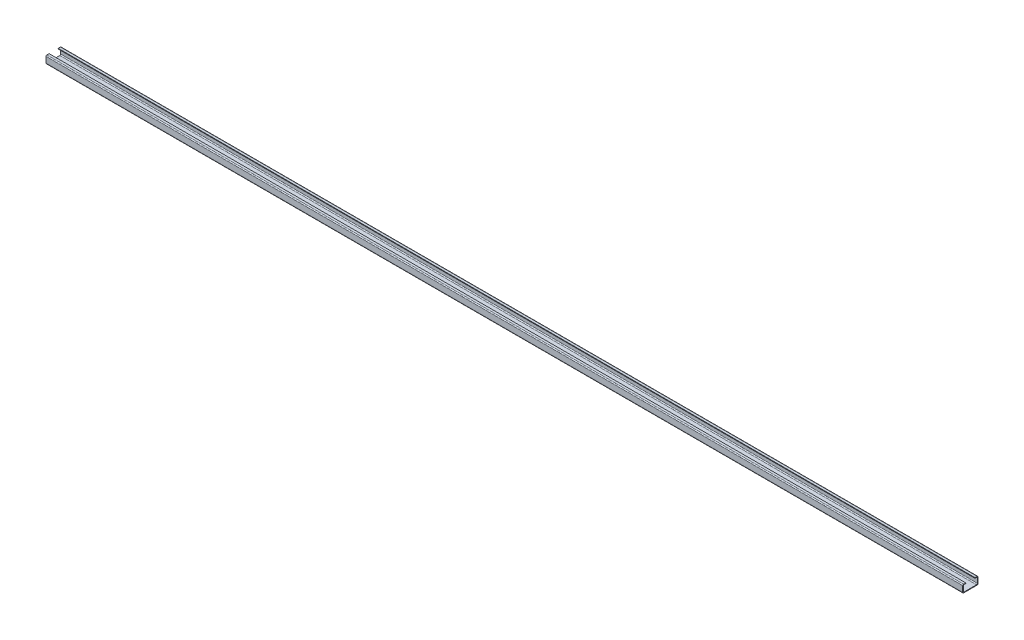
ISO-10303-21;
HEADER;
FILE_DESCRIPTION(('STEP AP214'),'2;1');
FILE_NAME('part.step','',(''),(''),'','','');
FILE_SCHEMA(('AUTOMOTIVE_DESIGN { 1 0 10303 214 1 1 1 1 }'));
ENDSEC;
DATA;
#1=APPLICATION_CONTEXT('core data for automotive mechanical design processes');
#2=APPLICATION_PROTOCOL_DEFINITION('international standard','automotive_design',2000,#1);
#3=PRODUCT_CONTEXT('',#1,'mechanical');
#4=PRODUCT('Part','Part','',(#3));
#5=PRODUCT_RELATED_PRODUCT_CATEGORY('part','',(#4));
#6=PRODUCT_DEFINITION_FORMATION('','',#4);
#7=PRODUCT_DEFINITION_CONTEXT('part definition',#1,'design');
#8=PRODUCT_DEFINITION('design','',#6,#7);
#9=PRODUCT_DEFINITION_SHAPE('','',#8);
#10=(LENGTH_UNIT() NAMED_UNIT(*) SI_UNIT(.MILLI.,.METRE.));
#11=(NAMED_UNIT(*) PLANE_ANGLE_UNIT() SI_UNIT($,.RADIAN.));
#12=(NAMED_UNIT(*) SI_UNIT($,.STERADIAN.) SOLID_ANGLE_UNIT());
#13=UNCERTAINTY_MEASURE_WITH_UNIT(LENGTH_MEASURE(1.E-05),#10,'distance_accuracy_value','');
#14=(GEOMETRIC_REPRESENTATION_CONTEXT(3) GLOBAL_UNCERTAINTY_ASSIGNED_CONTEXT((#13)) GLOBAL_UNIT_ASSIGNED_CONTEXT((#10,
#11,#12)) REPRESENTATION_CONTEXT('',''));
#15=CARTESIAN_POINT('',(0.,0.,0.));
#16=DIRECTION('',(0.,0.,1.));
#17=DIRECTION('',(1.,0.,0.));
#18=AXIS2_PLACEMENT_3D('',#15,#16,#17);
#19=CARTESIAN_POINT('',(6000.,25.,-50.));
#20=DIRECTION('',(0.,0.,1.));
#21=DIRECTION('',(0.,-1.,0.));
#22=AXIS2_PLACEMENT_3D('',#19,#20,#21);
#23=PLANE('',#22);
#24=DIRECTION('',(0.,1.,0.));
#25=VECTOR('',#24,1.);
#26=CARTESIAN_POINT('',(0.,25.,-50.));
#27=LINE('',#26,#25);
#28=CARTESIAN_POINT('',(0.,-19.,-50.));
#29=VERTEX_POINT('',#28);
#30=CARTESIAN_POINT('',(0.,19.,-50.));
#31=VERTEX_POINT('',#30);
#32=EDGE_CURVE('E227',#29,#31,#27,.T.);
#33=ORIENTED_EDGE('',*,*,#32,.T.);
#34=DIRECTION('',(-1.,0.,0.));
#35=VECTOR('',#34,1.);
#36=CARTESIAN_POINT('',(6000.,19.,-50.));
#37=LINE('',#36,#35);
#38=CARTESIAN_POINT('',(6000.,19.,-50.));
#39=VERTEX_POINT('',#38);
#40=EDGE_CURVE('E303',#31,#39,#37,.F.);
#41=ORIENTED_EDGE('',*,*,#40,.T.);
#42=DIRECTION('',(0.,1.,0.));
#43=VECTOR('',#42,1.);
#44=CARTESIAN_POINT('',(6000.,25.,-50.));
#45=LINE('',#44,#43);
#46=CARTESIAN_POINT('',(6000.,-19.,-50.));
#47=VERTEX_POINT('',#46);
#48=EDGE_CURVE('E187',#47,#39,#45,.T.);
#49=ORIENTED_EDGE('',*,*,#48,.F.);
#50=DIRECTION('',(-1.,0.,0.));
#51=VECTOR('',#50,1.);
#52=CARTESIAN_POINT('',(6000.,-19.,-50.));
#53=LINE('',#52,#51);
#54=EDGE_CURVE('E300',#47,#29,#53,.T.);
#55=ORIENTED_EDGE('',*,*,#54,.T.);
#56=EDGE_LOOP('',(#33,#41,#49,#55));
#57=FACE_BOUND('',#56,.T.);
#58=ADVANCED_FACE('F37',(#57),#23,.F.);
#59=CARTESIAN_POINT('',(6000.,25.,-30.));
#60=DIRECTION('',(0.,-1.,0.));
#61=DIRECTION('',(0.,0.,-1.));
#62=AXIS2_PLACEMENT_3D('',#59,#60,#61);
#63=PLANE('',#62);
#64=DIRECTION('',(0.,0.,1.));
#65=VECTOR('',#64,1.);
#66=CARTESIAN_POINT('',(6000.,25.,-30.));
#67=LINE('',#66,#65);
#68=CARTESIAN_POINT('',(6000.,25.,-44.));
#69=VERTEX_POINT('',#68);
#70=CARTESIAN_POINT('',(6000.,25.,-30.));
#71=VERTEX_POINT('',#70);
#72=EDGE_CURVE('E173',#69,#71,#67,.T.);
#73=ORIENTED_EDGE('',*,*,#72,.F.);
#74=DIRECTION('',(-1.,0.,0.));
#75=VECTOR('',#74,1.);
#76=CARTESIAN_POINT('',(6000.,25.,-44.));
#77=LINE('',#76,#75);
#78=CARTESIAN_POINT('',(0.,25.,-44.));
#79=VERTEX_POINT('',#78);
#80=EDGE_CURVE('E298',#69,#79,#77,.T.);
#81=ORIENTED_EDGE('',*,*,#80,.T.);
#82=DIRECTION('',(0.,0.,1.));
#83=VECTOR('',#82,1.);
#84=CARTESIAN_POINT('',(0.,25.,-30.));
#85=LINE('',#84,#83);
#86=CARTESIAN_POINT('',(0.,25.,-30.));
#87=VERTEX_POINT('',#86);
#88=EDGE_CURVE('E193',#79,#87,#85,.T.);
#89=ORIENTED_EDGE('',*,*,#88,.T.);
#90=DIRECTION('',(-1.,0.,0.));
#91=VECTOR('',#90,1.);
#92=CARTESIAN_POINT('',(6000.,25.,-30.));
#93=LINE('',#92,#91);
#94=EDGE_CURVE('E190',#71,#87,#93,.T.);
#95=ORIENTED_EDGE('',*,*,#94,.F.);
#96=EDGE_LOOP('',(#73,#81,#89,#95));
#97=FACE_BOUND('',#96,.T.);
#98=ADVANCED_FACE('F191',(#97),#63,.F.);
#99=CARTESIAN_POINT('',(6000.,25.,-30.));
#100=DIRECTION('',(0.,0.,-1.));
#101=DIRECTION('',(-1.,0.,0.));
#102=AXIS2_PLACEMENT_3D('',#99,#100,#101);
#103=PLANE('',#102);
#104=DIRECTION('',(0.,-1.,0.));
#105=VECTOR('',#104,1.);
#106=CARTESIAN_POINT('',(0.,25.,-30.));
#107=LINE('',#106,#105);
#108=CARTESIAN_POINT('',(0.,21.,-30.));
#109=VERTEX_POINT('',#108);
#110=EDGE_CURVE('E231',#87,#109,#107,.T.);
#111=ORIENTED_EDGE('',*,*,#110,.T.);
#112=DIRECTION('',(-1.,0.,0.));
#113=VECTOR('',#112,1.);
#114=CARTESIAN_POINT('',(6000.,21.,-30.));
#115=LINE('',#114,#113);
#116=CARTESIAN_POINT('',(6000.,21.,-30.));
#117=VERTEX_POINT('',#116);
#118=EDGE_CURVE('E197',#117,#109,#115,.T.);
#119=ORIENTED_EDGE('',*,*,#118,.F.);
#120=DIRECTION('',(0.,-1.,0.));
#121=VECTOR('',#120,1.);
#122=CARTESIAN_POINT('',(6000.,25.,-30.));
#123=LINE('',#122,#121);
#124=EDGE_CURVE('E179',#71,#117,#123,.T.);
#125=ORIENTED_EDGE('',*,*,#124,.F.);
#126=ORIENTED_EDGE('',*,*,#94,.T.);
#127=EDGE_LOOP('',(#111,#119,#125,#126));
#128=FACE_BOUND('',#127,.T.);
#129=ADVANCED_FACE('F199',(#128),#103,.F.);
#130=CARTESIAN_POINT('',(6000.,21.,-30.));
#131=DIRECTION('',(0.,1.,0.));
#132=DIRECTION('',(0.,0.,1.));
#133=AXIS2_PLACEMENT_3D('',#130,#131,#132);
#134=PLANE('',#133);
#135=DIRECTION('',(0.,0.,-1.));
#136=VECTOR('',#135,1.);
#137=CARTESIAN_POINT('',(0.,21.,-30.));
#138=LINE('',#137,#136);
#139=CARTESIAN_POINT('',(0.,21.,-40.));
#140=VERTEX_POINT('',#139);
#141=EDGE_CURVE('E233',#109,#140,#138,.T.);
#142=ORIENTED_EDGE('',*,*,#141,.T.);
#143=DIRECTION('',(-1.,0.,0.));
#144=VECTOR('',#143,1.);
#145=CARTESIAN_POINT('',(6000.,21.,-40.));
#146=LINE('',#145,#144);
#147=CARTESIAN_POINT('',(6000.,21.,-40.));
#148=VERTEX_POINT('',#147);
#149=EDGE_CURVE('E267',#140,#148,#146,.F.);
#150=ORIENTED_EDGE('',*,*,#149,.T.);
#151=DIRECTION('',(0.,0.,-1.));
#152=VECTOR('',#151,1.);
#153=CARTESIAN_POINT('',(6000.,21.,-30.));
#154=LINE('',#153,#152);
#155=EDGE_CURVE('E202',#117,#148,#154,.T.);
#156=ORIENTED_EDGE('',*,*,#155,.F.);
#157=ORIENTED_EDGE('',*,*,#118,.T.);
#158=EDGE_LOOP('',(#142,#150,#156,#157));
#159=FACE_BOUND('',#158,.T.);
#160=ADVANCED_FACE('F462',(#159),#134,.F.);
#161=CARTESIAN_POINT('',(6000.,21.,-46.));
#162=DIRECTION('',(0.,0.,-1.));
#163=DIRECTION('',(0.,1.,0.));
#164=AXIS2_PLACEMENT_3D('',#161,#162,#163);
#165=PLANE('',#164);
#166=DIRECTION('',(0.,-1.,0.));
#167=VECTOR('',#166,1.);
#168=CARTESIAN_POINT('',(6000.,21.,-46.));
#169=LINE('',#168,#167);
#170=CARTESIAN_POINT('',(6000.,15.,-46.));
#171=VERTEX_POINT('',#170);
#172=CARTESIAN_POINT('',(6000.,-15.,-46.));
#173=VERTEX_POINT('',#172);
#174=EDGE_CURVE('E204',#171,#173,#169,.T.);
#175=ORIENTED_EDGE('',*,*,#174,.F.);
#176=DIRECTION('',(-1.,0.,0.));
#177=VECTOR('',#176,1.);
#178=CARTESIAN_POINT('',(0.,15.,-46.));
#179=LINE('',#178,#177);
#180=CARTESIAN_POINT('',(0.,15.,-46.));
#181=VERTEX_POINT('',#180);
#182=EDGE_CURVE('E264',#171,#181,#179,.T.);
#183=ORIENTED_EDGE('',*,*,#182,.T.);
#184=DIRECTION('',(0.,-1.,0.));
#185=VECTOR('',#184,1.);
#186=CARTESIAN_POINT('',(0.,21.,-46.));
#187=LINE('',#186,#185);
#188=CARTESIAN_POINT('',(0.,-15.,-46.));
#189=VERTEX_POINT('',#188);
#190=EDGE_CURVE('E236',#181,#189,#187,.T.);
#191=ORIENTED_EDGE('',*,*,#190,.T.);
#192=DIRECTION('',(-1.,0.,0.));
#193=VECTOR('',#192,1.);
#194=CARTESIAN_POINT('',(6000.,-15.,-46.));
#195=LINE('',#194,#193);
#196=EDGE_CURVE('E196',#189,#173,#195,.F.);
#197=ORIENTED_EDGE('',*,*,#196,.T.);
#198=EDGE_LOOP('',(#175,#183,#191,#197));
#199=FACE_BOUND('',#198,.T.);
#200=ADVANCED_FACE('F457',(#199),#165,.F.);
#201=CARTESIAN_POINT('',(6000.,-21.,46.));
#202=DIRECTION('',(0.,-1.,0.));
#203=DIRECTION('',(0.,0.,-1.));
#204=AXIS2_PLACEMENT_3D('',#201,#202,#203);
#205=PLANE('',#204);
#206=DIRECTION('',(0.,0.,1.));
#207=VECTOR('',#206,1.);
#208=CARTESIAN_POINT('',(6000.,-21.,46.));
#209=LINE('',#208,#207);
#210=CARTESIAN_POINT('',(6000.,-21.,-40.));
#211=VERTEX_POINT('',#210);
#212=CARTESIAN_POINT('',(6000.,-21.,40.));
#213=VERTEX_POINT('',#212);
#214=EDGE_CURVE('E210',#211,#213,#209,.T.);
#215=ORIENTED_EDGE('',*,*,#214,.F.);
#216=DIRECTION('',(-1.,0.,0.));
#217=VECTOR('',#216,1.);
#218=CARTESIAN_POINT('',(0.,-21.,-40.));
#219=LINE('',#218,#217);
#220=CARTESIAN_POINT('',(0.,-21.,-40.));
#221=VERTEX_POINT('',#220);
#222=EDGE_CURVE('E311',#211,#221,#219,.T.);
#223=ORIENTED_EDGE('',*,*,#222,.T.);
#224=DIRECTION('',(0.,0.,1.));
#225=VECTOR('',#224,1.);
#226=CARTESIAN_POINT('',(0.,-21.,46.));
#227=LINE('',#226,#225);
#228=CARTESIAN_POINT('',(0.,-21.,40.));
#229=VERTEX_POINT('',#228);
#230=EDGE_CURVE('E239',#221,#229,#227,.T.);
#231=ORIENTED_EDGE('',*,*,#230,.T.);
#232=DIRECTION('',(-1.,0.,0.));
#233=VECTOR('',#232,1.);
#234=CARTESIAN_POINT('',(6000.,-21.,40.));
#235=LINE('',#234,#233);
#236=EDGE_CURVE('E309',#229,#213,#235,.F.);
#237=ORIENTED_EDGE('',*,*,#236,.T.);
#238=EDGE_LOOP('',(#215,#223,#231,#237));
#239=FACE_BOUND('',#238,.T.);
#240=ADVANCED_FACE('F335',(#239),#205,.F.);
#241=CARTESIAN_POINT('',(6000.,21.,46.));
#242=DIRECTION('',(0.,0.,1.));
#243=DIRECTION('',(0.,-1.,0.));
#244=AXIS2_PLACEMENT_3D('',#241,#242,#243);
#245=PLANE('',#244);
#246=DIRECTION('',(0.,1.,0.));
#247=VECTOR('',#246,1.);
#248=CARTESIAN_POINT('',(0.,21.,46.));
#249=LINE('',#248,#247);
#250=CARTESIAN_POINT('',(0.,-15.,46.));
#251=VERTEX_POINT('',#250);
#252=CARTESIAN_POINT('',(0.,15.,46.));
#253=VERTEX_POINT('',#252);
#254=EDGE_CURVE('E242',#251,#253,#249,.T.);
#255=ORIENTED_EDGE('',*,*,#254,.T.);
#256=DIRECTION('',(-1.,0.,0.));
#257=VECTOR('',#256,1.);
#258=CARTESIAN_POINT('',(6000.,15.,46.));
#259=LINE('',#258,#257);
#260=CARTESIAN_POINT('',(6000.,15.,46.));
#261=VERTEX_POINT('',#260);
#262=EDGE_CURVE('E275',#253,#261,#259,.F.);
#263=ORIENTED_EDGE('',*,*,#262,.T.);
#264=DIRECTION('',(0.,1.,0.));
#265=VECTOR('',#264,1.);
#266=CARTESIAN_POINT('',(6000.,21.,46.));
#267=LINE('',#266,#265);
#268=CARTESIAN_POINT('',(6000.,-15.,46.));
#269=VERTEX_POINT('',#268);
#270=EDGE_CURVE('E213',#269,#261,#267,.T.);
#271=ORIENTED_EDGE('',*,*,#270,.F.);
#272=DIRECTION('',(-1.,0.,0.));
#273=VECTOR('',#272,1.);
#274=CARTESIAN_POINT('',(0.,-15.,46.));
#275=LINE('',#274,#273);
#276=EDGE_CURVE('E272',#269,#251,#275,.T.);
#277=ORIENTED_EDGE('',*,*,#276,.T.);
#278=EDGE_LOOP('',(#255,#263,#271,#277));
#279=FACE_BOUND('',#278,.T.);
#280=ADVANCED_FACE('F342',(#279),#245,.F.);
#281=CARTESIAN_POINT('',(6000.,21.,46.));
#282=DIRECTION('',(0.,1.,0.));
#283=DIRECTION('',(0.,0.,1.));
#284=AXIS2_PLACEMENT_3D('',#281,#282,#283);
#285=PLANE('',#284);
#286=DIRECTION('',(0.,0.,-1.));
#287=VECTOR('',#286,1.);
#288=CARTESIAN_POINT('',(6000.,21.,46.));
#289=LINE('',#288,#287);
#290=CARTESIAN_POINT('',(6000.,21.,40.));
#291=VERTEX_POINT('',#290);
#292=CARTESIAN_POINT('',(6000.,21.,30.));
#293=VERTEX_POINT('',#292);
#294=EDGE_CURVE('E216',#291,#293,#289,.T.);
#295=ORIENTED_EDGE('',*,*,#294,.F.);
#296=DIRECTION('',(-1.,0.,0.));
#297=VECTOR('',#296,1.);
#298=CARTESIAN_POINT('',(0.,21.,40.));
#299=LINE('',#298,#297);
#300=CARTESIAN_POINT('',(0.,21.,40.));
#301=VERTEX_POINT('',#300);
#302=EDGE_CURVE('E269',#291,#301,#299,.T.);
#303=ORIENTED_EDGE('',*,*,#302,.T.);
#304=DIRECTION('',(0.,0.,-1.));
#305=VECTOR('',#304,1.);
#306=CARTESIAN_POINT('',(0.,21.,46.));
#307=LINE('',#306,#305);
#308=CARTESIAN_POINT('',(0.,21.,30.));
#309=VERTEX_POINT('',#308);
#310=EDGE_CURVE('E245',#301,#309,#307,.T.);
#311=ORIENTED_EDGE('',*,*,#310,.T.);
#312=DIRECTION('',(-1.,0.,0.));
#313=VECTOR('',#312,1.);
#314=CARTESIAN_POINT('',(6000.,21.,30.));
#315=LINE('',#314,#313);
#316=EDGE_CURVE('E259',#293,#309,#315,.T.);
#317=ORIENTED_EDGE('',*,*,#316,.F.);
#318=EDGE_LOOP('',(#295,#303,#311,#317));
#319=FACE_BOUND('',#318,.T.);
#320=ADVANCED_FACE('F350',(#319),#285,.F.);
#321=CARTESIAN_POINT('',(6000.,25.,30.));
#322=DIRECTION('',(0.,0.,1.));
#323=DIRECTION('',(1.,0.,0.));
#324=AXIS2_PLACEMENT_3D('',#321,#322,#323);
#325=PLANE('',#324);
#326=DIRECTION('',(0.,1.,0.));
#327=VECTOR('',#326,1.);
#328=CARTESIAN_POINT('',(0.,25.,30.));
#329=LINE('',#328,#327);
#330=CARTESIAN_POINT('',(0.,25.,30.));
#331=VERTEX_POINT('',#330);
#332=EDGE_CURVE('E247',#309,#331,#329,.T.);
#333=ORIENTED_EDGE('',*,*,#332,.T.);
#334=DIRECTION('',(-1.,0.,0.));
#335=VECTOR('',#334,1.);
#336=CARTESIAN_POINT('',(6000.,25.,30.));
#337=LINE('',#336,#335);
#338=CARTESIAN_POINT('',(6000.,25.,30.));
#339=VERTEX_POINT('',#338);
#340=EDGE_CURVE('E226',#339,#331,#337,.T.);
#341=ORIENTED_EDGE('',*,*,#340,.F.);
#342=DIRECTION('',(0.,1.,0.));
#343=VECTOR('',#342,1.);
#344=CARTESIAN_POINT('',(6000.,25.,30.));
#345=LINE('',#344,#343);
#346=EDGE_CURVE('E218',#293,#339,#345,.T.);
#347=ORIENTED_EDGE('',*,*,#346,.F.);
#348=ORIENTED_EDGE('',*,*,#316,.T.);
#349=EDGE_LOOP('',(#333,#341,#347,#348));
#350=FACE_BOUND('',#349,.T.);
#351=ADVANCED_FACE('F356',(#350),#325,.F.);
#352=CARTESIAN_POINT('',(6000.,25.,50.));
#353=DIRECTION('',(0.,-1.,0.));
#354=DIRECTION('',(0.,0.,-1.));
#355=AXIS2_PLACEMENT_3D('',#352,#353,#354);
#356=PLANE('',#355);
#357=DIRECTION('',(0.,0.,1.));
#358=VECTOR('',#357,1.);
#359=CARTESIAN_POINT('',(0.,25.,50.));
#360=LINE('',#359,#358);
#361=CARTESIAN_POINT('',(0.,25.,44.));
#362=VERTEX_POINT('',#361);
#363=EDGE_CURVE('E249',#331,#362,#360,.T.);
#364=ORIENTED_EDGE('',*,*,#363,.T.);
#365=DIRECTION('',(-1.,0.,0.));
#366=VECTOR('',#365,1.);
#367=CARTESIAN_POINT('',(6000.,25.,44.));
#368=LINE('',#367,#366);
#369=CARTESIAN_POINT('',(6000.,25.,44.));
#370=VERTEX_POINT('',#369);
#371=EDGE_CURVE('E290',#362,#370,#368,.F.);
#372=ORIENTED_EDGE('',*,*,#371,.T.);
#373=DIRECTION('',(0.,0.,1.));
#374=VECTOR('',#373,1.);
#375=CARTESIAN_POINT('',(6000.,25.,50.));
#376=LINE('',#375,#374);
#377=EDGE_CURVE('E220',#339,#370,#376,.T.);
#378=ORIENTED_EDGE('',*,*,#377,.F.);
#379=ORIENTED_EDGE('',*,*,#340,.T.);
#380=EDGE_LOOP('',(#364,#372,#378,#379));
#381=FACE_BOUND('',#380,.T.);
#382=ADVANCED_FACE('F479',(#381),#356,.F.);
#383=CARTESIAN_POINT('',(6000.,25.,50.));
#384=DIRECTION('',(0.,0.,-1.));
#385=DIRECTION('',(0.,1.,0.));
#386=AXIS2_PLACEMENT_3D('',#383,#384,#385);
#387=PLANE('',#386);
#388=DIRECTION('',(0.,-1.,0.));
#389=VECTOR('',#388,1.);
#390=CARTESIAN_POINT('',(6000.,25.,50.));
#391=LINE('',#390,#389);
#392=CARTESIAN_POINT('',(6000.,19.,50.));
#393=VERTEX_POINT('',#392);
#394=CARTESIAN_POINT('',(6000.,-19.,50.));
#395=VERTEX_POINT('',#394);
#396=EDGE_CURVE('E222',#393,#395,#391,.T.);
#397=ORIENTED_EDGE('',*,*,#396,.F.);
#398=DIRECTION('',(-1.,0.,0.));
#399=VECTOR('',#398,1.);
#400=CARTESIAN_POINT('',(6000.,19.,50.));
#401=LINE('',#400,#399);
#402=CARTESIAN_POINT('',(0.,19.,50.));
#403=VERTEX_POINT('',#402);
#404=EDGE_CURVE('E279',#393,#403,#401,.T.);
#405=ORIENTED_EDGE('',*,*,#404,.T.);
#406=DIRECTION('',(0.,-1.,0.));
#407=VECTOR('',#406,1.);
#408=CARTESIAN_POINT('',(0.,25.,50.));
#409=LINE('',#408,#407);
#410=CARTESIAN_POINT('',(0.,-19.,50.));
#411=VERTEX_POINT('',#410);
#412=EDGE_CURVE('E252',#403,#411,#409,.T.);
#413=ORIENTED_EDGE('',*,*,#412,.T.);
#414=DIRECTION('',(-1.,0.,0.));
#415=VECTOR('',#414,1.);
#416=CARTESIAN_POINT('',(6000.,-19.,50.));
#417=LINE('',#416,#415);
#418=EDGE_CURVE('E277',#411,#395,#417,.F.);
#419=ORIENTED_EDGE('',*,*,#418,.T.);
#420=EDGE_LOOP('',(#397,#405,#413,#419));
#421=FACE_BOUND('',#420,.T.);
#422=ADVANCED_FACE('F366',(#421),#387,.F.);
#423=CARTESIAN_POINT('',(6000.,-25.,50.));
#424=DIRECTION('',(0.,1.,0.));
#425=DIRECTION('',(0.,0.,1.));
#426=AXIS2_PLACEMENT_3D('',#423,#424,#425);
#427=PLANE('',#426);
#428=DIRECTION('',(0.,0.,-1.));
#429=VECTOR('',#428,1.);
#430=CARTESIAN_POINT('',(0.,-25.,50.));
#431=LINE('',#430,#429);
#432=CARTESIAN_POINT('',(0.,-25.,44.));
#433=VERTEX_POINT('',#432);
#434=CARTESIAN_POINT('',(0.,-25.,-44.));
#435=VERTEX_POINT('',#434);
#436=EDGE_CURVE('E255',#433,#435,#431,.T.);
#437=ORIENTED_EDGE('',*,*,#436,.T.);
#438=DIRECTION('',(-1.,0.,0.));
#439=VECTOR('',#438,1.);
#440=CARTESIAN_POINT('',(6000.,-25.,-44.));
#441=LINE('',#440,#439);
#442=CARTESIAN_POINT('',(6000.,-25.,-44.));
#443=VERTEX_POINT('',#442);
#444=EDGE_CURVE('E52',#435,#443,#441,.F.);
#445=ORIENTED_EDGE('',*,*,#444,.T.);
#446=DIRECTION('',(0.,0.,-1.));
#447=VECTOR('',#446,1.);
#448=CARTESIAN_POINT('',(6000.,-25.,50.));
#449=LINE('',#448,#447);
#450=CARTESIAN_POINT('',(6000.,-25.,44.));
#451=VERTEX_POINT('',#450);
#452=EDGE_CURVE('E224',#451,#443,#449,.T.);
#453=ORIENTED_EDGE('',*,*,#452,.F.);
#454=DIRECTION('',(-1.,0.,0.));
#455=VECTOR('',#454,1.);
#456=CARTESIAN_POINT('',(6000.,-25.,44.));
#457=LINE('',#456,#455);
#458=EDGE_CURVE('E305',#451,#433,#457,.T.);
#459=ORIENTED_EDGE('',*,*,#458,.T.);
#460=EDGE_LOOP('',(#437,#445,#453,#459));
#461=FACE_BOUND('',#460,.T.);
#462=ADVANCED_FACE('F372',(#461),#427,.F.);
#463=CARTESIAN_POINT('',(6000.,0.,0.));
#464=DIRECTION('',(1.,0.,0.));
#465=DIRECTION('',(0.,0.,-1.));
#466=AXIS2_PLACEMENT_3D('',#463,#464,#465);
#467=PLANE('',#466);
#468=ORIENTED_EDGE('',*,*,#377,.T.);
#469=CARTESIAN_POINT('',(6000.,19.,44.));
#470=DIRECTION('',(1.,0.,0.));
#471=DIRECTION('',(0.,0.,-1.));
#472=AXIS2_PLACEMENT_3D('',#469,#470,#471);
#473=CIRCLE('',#472,6.);
#474=EDGE_CURVE('E296',#370,#393,#473,.T.);
#475=ORIENTED_EDGE('',*,*,#474,.T.);
#476=ORIENTED_EDGE('',*,*,#396,.T.);
#477=CARTESIAN_POINT('',(6000.,-19.,44.));
#478=DIRECTION('',(1.,0.,0.));
#479=DIRECTION('',(0.,0.,-1.));
#480=AXIS2_PLACEMENT_3D('',#477,#478,#479);
#481=CIRCLE('',#480,6.);
#482=EDGE_CURVE('E59',#395,#451,#481,.T.);
#483=ORIENTED_EDGE('',*,*,#482,.T.);
#484=ORIENTED_EDGE('',*,*,#452,.T.);
#485=CARTESIAN_POINT('',(6000.,-19.,-44.));
#486=DIRECTION('',(1.,0.,0.));
#487=DIRECTION('',(0.,0.,-1.));
#488=AXIS2_PLACEMENT_3D('',#485,#486,#487);
#489=CIRCLE('',#488,6.);
#490=EDGE_CURVE('E293',#443,#47,#489,.T.);
#491=ORIENTED_EDGE('',*,*,#490,.T.);
#492=ORIENTED_EDGE('',*,*,#48,.T.);
#493=CARTESIAN_POINT('',(6000.,19.,-44.));
#494=DIRECTION('',(1.,0.,0.));
#495=DIRECTION('',(0.,0.,-1.));
#496=AXIS2_PLACEMENT_3D('',#493,#494,#495);
#497=CIRCLE('',#496,6.);
#498=EDGE_CURVE('E183',#39,#69,#497,.T.);
#499=ORIENTED_EDGE('',*,*,#498,.T.);
#500=ORIENTED_EDGE('',*,*,#72,.T.);
#501=ORIENTED_EDGE('',*,*,#124,.T.);
#502=ORIENTED_EDGE('',*,*,#155,.T.);
#503=CARTESIAN_POINT('',(6000.,15.,-40.));
#504=DIRECTION('',(1.,0.,0.));
#505=DIRECTION('',(0.,0.,-1.));
#506=AXIS2_PLACEMENT_3D('',#503,#504,#505);
#507=CIRCLE('',#506,6.);
#508=EDGE_CURVE('E316',#148,#171,#507,.F.);
#509=ORIENTED_EDGE('',*,*,#508,.T.);
#510=ORIENTED_EDGE('',*,*,#174,.T.);
#511=CARTESIAN_POINT('',(6000.,-15.,-40.));
#512=DIRECTION('',(1.,0.,0.));
#513=DIRECTION('',(0.,0.,-1.));
#514=AXIS2_PLACEMENT_3D('',#511,#512,#513);
#515=CIRCLE('',#514,6.);
#516=EDGE_CURVE('E324',#173,#211,#515,.F.);
#517=ORIENTED_EDGE('',*,*,#516,.T.);
#518=ORIENTED_EDGE('',*,*,#214,.T.);
#519=CARTESIAN_POINT('',(6000.,-15.,40.));
#520=DIRECTION('',(1.,0.,0.));
#521=DIRECTION('',(0.,0.,-1.));
#522=AXIS2_PLACEMENT_3D('',#519,#520,#521);
#523=CIRCLE('',#522,6.);
#524=EDGE_CURVE('E11',#213,#269,#523,.F.);
#525=ORIENTED_EDGE('',*,*,#524,.T.);
#526=ORIENTED_EDGE('',*,*,#270,.T.);
#527=CARTESIAN_POINT('',(6000.,15.,40.));
#528=DIRECTION('',(1.,0.,0.));
#529=DIRECTION('',(0.,0.,-1.));
#530=AXIS2_PLACEMENT_3D('',#527,#528,#529);
#531=CIRCLE('',#530,6.);
#532=EDGE_CURVE('E320',#261,#291,#531,.F.);
#533=ORIENTED_EDGE('',*,*,#532,.T.);
#534=ORIENTED_EDGE('',*,*,#294,.T.);
#535=ORIENTED_EDGE('',*,*,#346,.T.);
#536=EDGE_LOOP('',(#468,#475,#476,#483,#484,#491,#492,#499,#500,#501,#502,#509,#510,#517,#518,
#525,#526,#533,#534,#535));
#537=FACE_BOUND('',#536,.T.);
#538=ADVANCED_FACE('F176',(#537),#467,.T.);
#539=CARTESIAN_POINT('',(0.,0.,0.));
#540=DIRECTION('',(1.,0.,0.));
#541=DIRECTION('',(0.,0.,-1.));
#542=AXIS2_PLACEMENT_3D('',#539,#540,#541);
#543=PLANE('',#542);
#544=ORIENTED_EDGE('',*,*,#412,.F.);
#545=CARTESIAN_POINT('',(0.,19.,44.));
#546=DIRECTION('',(1.,0.,0.));
#547=DIRECTION('',(0.,0.,-1.));
#548=AXIS2_PLACEMENT_3D('',#545,#546,#547);
#549=CIRCLE('',#548,6.);
#550=EDGE_CURVE('E288',#403,#362,#549,.F.);
#551=ORIENTED_EDGE('',*,*,#550,.T.);
#552=ORIENTED_EDGE('',*,*,#363,.F.);
#553=ORIENTED_EDGE('',*,*,#332,.F.);
#554=ORIENTED_EDGE('',*,*,#310,.F.);
#555=CARTESIAN_POINT('',(0.,15.,40.));
#556=DIRECTION('',(1.,0.,0.));
#557=DIRECTION('',(0.,0.,-1.));
#558=AXIS2_PLACEMENT_3D('',#555,#556,#557);
#559=CIRCLE('',#558,6.);
#560=EDGE_CURVE('E318',#301,#253,#559,.T.);
#561=ORIENTED_EDGE('',*,*,#560,.T.);
#562=ORIENTED_EDGE('',*,*,#254,.F.);
#563=CARTESIAN_POINT('',(0.,-15.,40.));
#564=DIRECTION('',(1.,0.,0.));
#565=DIRECTION('',(0.,0.,-1.));
#566=AXIS2_PLACEMENT_3D('',#563,#564,#565);
#567=CIRCLE('',#566,6.);
#568=EDGE_CURVE('E45',#251,#229,#567,.T.);
#569=ORIENTED_EDGE('',*,*,#568,.T.);
#570=ORIENTED_EDGE('',*,*,#230,.F.);
#571=CARTESIAN_POINT('',(0.,-15.,-40.));
#572=DIRECTION('',(1.,0.,0.));
#573=DIRECTION('',(0.,0.,-1.));
#574=AXIS2_PLACEMENT_3D('',#571,#572,#573);
#575=CIRCLE('',#574,6.);
#576=EDGE_CURVE('E322',#221,#189,#575,.T.);
#577=ORIENTED_EDGE('',*,*,#576,.T.);
#578=ORIENTED_EDGE('',*,*,#190,.F.);
#579=CARTESIAN_POINT('',(0.,15.,-40.));
#580=DIRECTION('',(1.,0.,0.));
#581=DIRECTION('',(0.,0.,-1.));
#582=AXIS2_PLACEMENT_3D('',#579,#580,#581);
#583=CIRCLE('',#582,6.);
#584=EDGE_CURVE('E314',#181,#140,#583,.T.);
#585=ORIENTED_EDGE('',*,*,#584,.T.);
#586=ORIENTED_EDGE('',*,*,#141,.F.);
#587=ORIENTED_EDGE('',*,*,#110,.F.);
#588=ORIENTED_EDGE('',*,*,#88,.F.);
#589=CARTESIAN_POINT('',(0.,19.,-44.));
#590=DIRECTION('',(1.,0.,0.));
#591=DIRECTION('',(0.,0.,-1.));
#592=AXIS2_PLACEMENT_3D('',#589,#590,#591);
#593=CIRCLE('',#592,6.);
#594=EDGE_CURVE('E286',#79,#31,#593,.F.);
#595=ORIENTED_EDGE('',*,*,#594,.T.);
#596=ORIENTED_EDGE('',*,*,#32,.F.);
#597=CARTESIAN_POINT('',(0.,-19.,-44.));
#598=DIRECTION('',(1.,0.,0.));
#599=DIRECTION('',(0.,0.,-1.));
#600=AXIS2_PLACEMENT_3D('',#597,#598,#599);
#601=CIRCLE('',#600,6.);
#602=EDGE_CURVE('E284',#29,#435,#601,.F.);
#603=ORIENTED_EDGE('',*,*,#602,.T.);
#604=ORIENTED_EDGE('',*,*,#436,.F.);
#605=CARTESIAN_POINT('',(0.,-19.,44.));
#606=DIRECTION('',(1.,0.,0.));
#607=DIRECTION('',(0.,0.,-1.));
#608=AXIS2_PLACEMENT_3D('',#605,#606,#607);
#609=CIRCLE('',#608,6.);
#610=EDGE_CURVE('E282',#433,#411,#609,.F.);
#611=ORIENTED_EDGE('',*,*,#610,.T.);
#612=EDGE_LOOP('',(#544,#551,#552,#553,#554,#561,#562,#569,#570,#577,#578,#585,#586,#587,#588,
#595,#596,#603,#604,#611));
#613=FACE_BOUND('',#612,.T.);
#614=ADVANCED_FACE('F329',(#613),#543,.F.);
#615=CARTESIAN_POINT('',(6000.,15.,-40.));
#616=DIRECTION('',(1.,0.,0.));
#617=DIRECTION('',(0.,0.,-1.));
#618=AXIS2_PLACEMENT_3D('',#615,#616,#617);
#619=CYLINDRICAL_SURFACE('',#618,6.);
#620=ORIENTED_EDGE('',*,*,#508,.F.);
#621=ORIENTED_EDGE('',*,*,#149,.F.);
#622=ORIENTED_EDGE('',*,*,#584,.F.);
#623=ORIENTED_EDGE('',*,*,#182,.F.);
#624=EDGE_LOOP('',(#620,#621,#622,#623));
#625=FACE_BOUND('',#624,.T.);
#626=ADVANCED_FACE('F400',(#625),#619,.F.);
#627=CARTESIAN_POINT('',(6000.,15.,40.));
#628=DIRECTION('',(1.,0.,0.));
#629=DIRECTION('',(0.,0.,-1.));
#630=AXIS2_PLACEMENT_3D('',#627,#628,#629);
#631=CYLINDRICAL_SURFACE('',#630,6.);
#632=ORIENTED_EDGE('',*,*,#532,.F.);
#633=ORIENTED_EDGE('',*,*,#262,.F.);
#634=ORIENTED_EDGE('',*,*,#560,.F.);
#635=ORIENTED_EDGE('',*,*,#302,.F.);
#636=EDGE_LOOP('',(#632,#633,#634,#635));
#637=FACE_BOUND('',#636,.T.);
#638=ADVANCED_FACE('F345',(#637),#631,.F.);
#639=CARTESIAN_POINT('',(6000.,19.,44.));
#640=DIRECTION('',(-1.,0.,0.));
#641=DIRECTION('',(0.,0.,1.));
#642=AXIS2_PLACEMENT_3D('',#639,#640,#641);
#643=CYLINDRICAL_SURFACE('',#642,6.);
#644=ORIENTED_EDGE('',*,*,#474,.F.);
#645=ORIENTED_EDGE('',*,*,#371,.F.);
#646=ORIENTED_EDGE('',*,*,#550,.F.);
#647=ORIENTED_EDGE('',*,*,#404,.F.);
#648=EDGE_LOOP('',(#644,#645,#646,#647));
#649=FACE_BOUND('',#648,.T.);
#650=ADVANCED_FACE('F364',(#649),#643,.T.);
#651=CARTESIAN_POINT('',(6000.,19.,-44.));
#652=DIRECTION('',(-1.,0.,0.));
#653=DIRECTION('',(0.,0.,1.));
#654=AXIS2_PLACEMENT_3D('',#651,#652,#653);
#655=CYLINDRICAL_SURFACE('',#654,6.);
#656=ORIENTED_EDGE('',*,*,#498,.F.);
#657=ORIENTED_EDGE('',*,*,#40,.F.);
#658=ORIENTED_EDGE('',*,*,#594,.F.);
#659=ORIENTED_EDGE('',*,*,#80,.F.);
#660=EDGE_LOOP('',(#656,#657,#658,#659));
#661=FACE_BOUND('',#660,.T.);
#662=ADVANCED_FACE('F382',(#661),#655,.T.);
#663=CARTESIAN_POINT('',(6000.,-19.,-44.));
#664=DIRECTION('',(-1.,0.,0.));
#665=DIRECTION('',(0.,0.,1.));
#666=AXIS2_PLACEMENT_3D('',#663,#664,#665);
#667=CYLINDRICAL_SURFACE('',#666,6.);
#668=ORIENTED_EDGE('',*,*,#490,.F.);
#669=ORIENTED_EDGE('',*,*,#444,.F.);
#670=ORIENTED_EDGE('',*,*,#602,.F.);
#671=ORIENTED_EDGE('',*,*,#54,.F.);
#672=EDGE_LOOP('',(#668,#669,#670,#671));
#673=FACE_BOUND('',#672,.T.);
#674=ADVANCED_FACE('F377',(#673),#667,.T.);
#675=CARTESIAN_POINT('',(6000.,-15.,-40.));
#676=DIRECTION('',(1.,0.,0.));
#677=DIRECTION('',(0.,0.,-1.));
#678=AXIS2_PLACEMENT_3D('',#675,#676,#677);
#679=CYLINDRICAL_SURFACE('',#678,6.);
#680=ORIENTED_EDGE('',*,*,#516,.F.);
#681=ORIENTED_EDGE('',*,*,#196,.F.);
#682=ORIENTED_EDGE('',*,*,#576,.F.);
#683=ORIENTED_EDGE('',*,*,#222,.F.);
#684=EDGE_LOOP('',(#680,#681,#682,#683));
#685=FACE_BOUND('',#684,.T.);
#686=ADVANCED_FACE('F389',(#685),#679,.F.);
#687=CARTESIAN_POINT('',(6000.,-15.,40.));
#688=DIRECTION('',(1.,0.,0.));
#689=DIRECTION('',(0.,0.,-1.));
#690=AXIS2_PLACEMENT_3D('',#687,#688,#689);
#691=CYLINDRICAL_SURFACE('',#690,6.);
#692=ORIENTED_EDGE('',*,*,#524,.F.);
#693=ORIENTED_EDGE('',*,*,#236,.F.);
#694=ORIENTED_EDGE('',*,*,#568,.F.);
#695=ORIENTED_EDGE('',*,*,#276,.F.);
#696=EDGE_LOOP('',(#692,#693,#694,#695));
#697=FACE_BOUND('',#696,.T.);
#698=ADVANCED_FACE('F338',(#697),#691,.F.);
#699=CARTESIAN_POINT('',(6000.,-19.,44.));
#700=DIRECTION('',(-1.,0.,0.));
#701=DIRECTION('',(0.,0.,1.));
#702=AXIS2_PLACEMENT_3D('',#699,#700,#701);
#703=CYLINDRICAL_SURFACE('',#702,6.);
#704=ORIENTED_EDGE('',*,*,#482,.F.);
#705=ORIENTED_EDGE('',*,*,#418,.F.);
#706=ORIENTED_EDGE('',*,*,#610,.F.);
#707=ORIENTED_EDGE('',*,*,#458,.F.);
#708=EDGE_LOOP('',(#704,#705,#706,#707));
#709=FACE_BOUND('',#708,.T.);
#710=ADVANCED_FACE('F39',(#709),#703,.T.);
#711=CLOSED_SHELL('',(#58,#98,#129,#160,#200,#240,#280,#320,#351,#382,#422,#462,#538,#614,#626,
#638,#650,#662,#674,#686,#698,#710));
#712=MANIFOLD_SOLID_BREP('B2',#711);
#713=ADVANCED_BREP_SHAPE_REPRESENTATION('',(#18,#712),#14);
#714=SHAPE_DEFINITION_REPRESENTATION(#9,#713);
ENDSEC;
END-ISO-10303-21;
